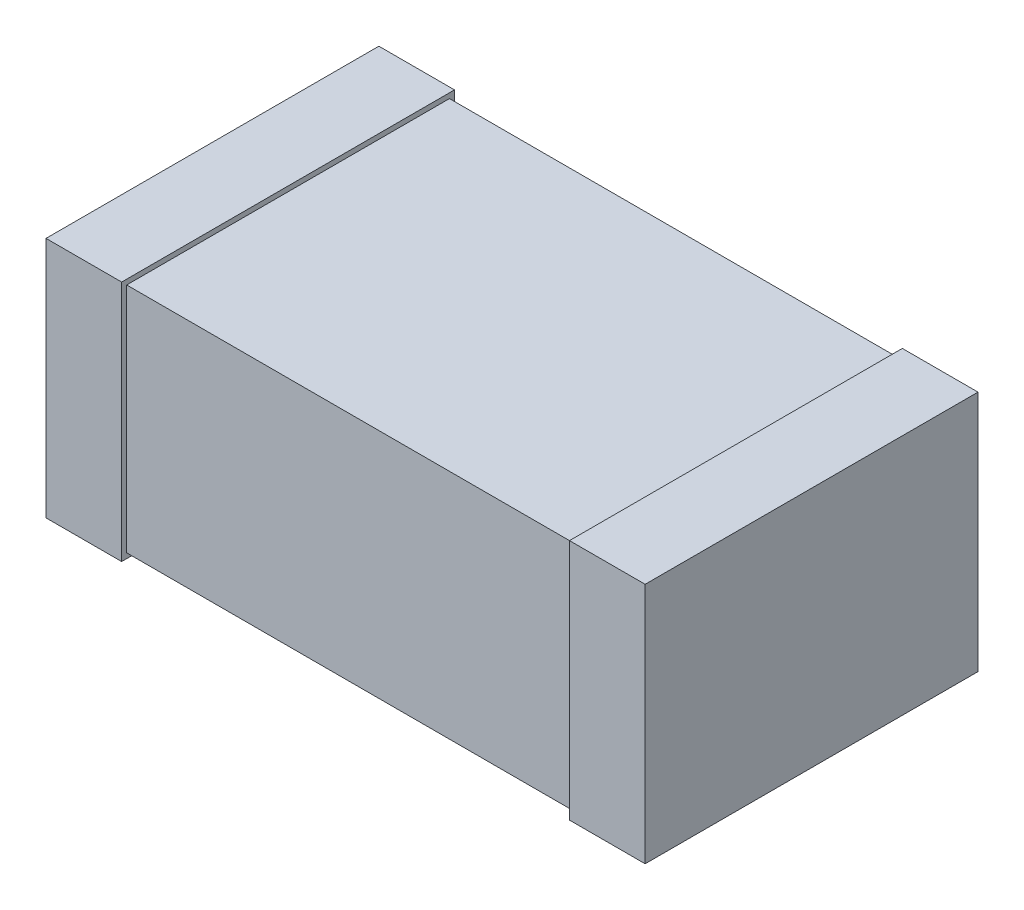
ISO-10303-21;
HEADER;
FILE_DESCRIPTION(('STEP AP214'),'2;1');
FILE_NAME('part.step','',(''),(''),'','','');
FILE_SCHEMA(('AUTOMOTIVE_DESIGN { 1 0 10303 214 1 1 1 1 }'));
ENDSEC;
DATA;
#1=APPLICATION_CONTEXT('core data for automotive mechanical design processes');
#2=APPLICATION_PROTOCOL_DEFINITION('international standard','automotive_design',2000,#1);
#3=PRODUCT_CONTEXT('',#1,'mechanical');
#4=PRODUCT('Part','Part','',(#3));
#5=PRODUCT_RELATED_PRODUCT_CATEGORY('part','',(#4));
#6=PRODUCT_DEFINITION_FORMATION('','',#4);
#7=PRODUCT_DEFINITION_CONTEXT('part definition',#1,'design');
#8=PRODUCT_DEFINITION('design','',#6,#7);
#9=PRODUCT_DEFINITION_SHAPE('','',#8);
#10=(LENGTH_UNIT() NAMED_UNIT(*) SI_UNIT(.MILLI.,.METRE.));
#11=(NAMED_UNIT(*) PLANE_ANGLE_UNIT() SI_UNIT($,.RADIAN.));
#12=(NAMED_UNIT(*) SI_UNIT($,.STERADIAN.) SOLID_ANGLE_UNIT());
#13=UNCERTAINTY_MEASURE_WITH_UNIT(LENGTH_MEASURE(1.E-05),#10,'distance_accuracy_value','');
#14=(GEOMETRIC_REPRESENTATION_CONTEXT(3) GLOBAL_UNCERTAINTY_ASSIGNED_CONTEXT((#13)) GLOBAL_UNIT_ASSIGNED_CONTEXT((#10,
#11,#12)) REPRESENTATION_CONTEXT('',''));
#15=CARTESIAN_POINT('',(0.,0.,0.));
#16=DIRECTION('',(0.,0.,1.));
#17=DIRECTION('',(1.,0.,0.));
#18=AXIS2_PLACEMENT_3D('',#15,#16,#17);
#19=CARTESIAN_POINT('',(-2.25000000000005,2.3,1.59999999999999));
#20=DIRECTION('',(0.,0.,-1.));
#21=DIRECTION('',(-1.,0.,0.));
#22=AXIS2_PLACEMENT_3D('',#19,#20,#21);
#23=PLANE('',#22);
#24=DIRECTION('',(0.,1.,0.));
#25=VECTOR('',#24,1.);
#26=CARTESIAN_POINT('',(-2.22000000000005,2.3,1.59999999999999));
#27=LINE('',#26,#25);
#28=CARTESIAN_POINT('',(-2.22,0.,1.59999999999999));
#29=VERTEX_POINT('',#28);
#30=CARTESIAN_POINT('',(-2.22000000000005,2.3,1.59999999999999));
#31=VERTEX_POINT('',#30);
#32=EDGE_CURVE('E171',#29,#31,#27,.T.);
#33=ORIENTED_EDGE('',*,*,#32,.F.);
#34=DIRECTION('',(1.,0.,0.));
#35=VECTOR('',#34,1.);
#36=CARTESIAN_POINT('',(-2.25,0.,1.59999999999999));
#37=LINE('',#36,#35);
#38=CARTESIAN_POINT('',(2.22,0.,1.6));
#39=VERTEX_POINT('',#38);
#40=EDGE_CURVE('E215',#29,#39,#37,.T.);
#41=ORIENTED_EDGE('',*,*,#40,.T.);
#42=DIRECTION('',(0.,-1.,0.));
#43=VECTOR('',#42,1.);
#44=CARTESIAN_POINT('',(2.21999999999995,2.3,1.6));
#45=LINE('',#44,#43);
#46=CARTESIAN_POINT('',(2.21999999999995,2.3,1.6));
#47=VERTEX_POINT('',#46);
#48=EDGE_CURVE('E210',#47,#39,#45,.T.);
#49=ORIENTED_EDGE('',*,*,#48,.F.);
#50=DIRECTION('',(1.,0.,0.));
#51=VECTOR('',#50,1.);
#52=CARTESIAN_POINT('',(-2.25000000000005,2.3,1.59999999999999));
#53=LINE('',#52,#51);
#54=EDGE_CURVE('E216',#31,#47,#53,.T.);
#55=ORIENTED_EDGE('',*,*,#54,.F.);
#56=EDGE_LOOP('',(#33,#41,#49,#55));
#57=FACE_BOUND('',#56,.T.);
#58=ADVANCED_FACE('F38',(#57),#23,.F.);
#59=CARTESIAN_POINT('',(-2.25,2.3,-1.6));
#60=DIRECTION('',(0.,0.,1.));
#61=DIRECTION('',(1.,0.,0.));
#62=AXIS2_PLACEMENT_3D('',#59,#60,#61);
#63=PLANE('',#62);
#64=DIRECTION('',(0.,-1.,0.));
#65=VECTOR('',#64,1.);
#66=CARTESIAN_POINT('',(-2.22,2.3,-1.6));
#67=LINE('',#66,#65);
#68=CARTESIAN_POINT('',(-2.22,2.3,-1.6));
#69=VERTEX_POINT('',#68);
#70=CARTESIAN_POINT('',(-2.22000000000005,0.,-1.6));
#71=VERTEX_POINT('',#70);
#72=EDGE_CURVE('E52',#69,#71,#67,.T.);
#73=ORIENTED_EDGE('',*,*,#72,.F.);
#74=DIRECTION('',(-1.,0.,0.));
#75=VECTOR('',#74,1.);
#76=CARTESIAN_POINT('',(-2.25,2.3,-1.6));
#77=LINE('',#76,#75);
#78=CARTESIAN_POINT('',(2.22,2.3,-1.6));
#79=VERTEX_POINT('',#78);
#80=EDGE_CURVE('E218',#79,#69,#77,.T.);
#81=ORIENTED_EDGE('',*,*,#80,.F.);
#82=DIRECTION('',(0.,1.,0.));
#83=VECTOR('',#82,1.);
#84=CARTESIAN_POINT('',(2.22,2.3,-1.6));
#85=LINE('',#84,#83);
#86=CARTESIAN_POINT('',(2.21999999999995,0.,-1.6));
#87=VERTEX_POINT('',#86);
#88=EDGE_CURVE('E202',#87,#79,#85,.T.);
#89=ORIENTED_EDGE('',*,*,#88,.F.);
#90=DIRECTION('',(-1.,0.,0.));
#91=VECTOR('',#90,1.);
#92=CARTESIAN_POINT('',(-2.25000000000005,0.,-1.6));
#93=LINE('',#92,#91);
#94=EDGE_CURVE('E219',#87,#71,#93,.T.);
#95=ORIENTED_EDGE('',*,*,#94,.T.);
#96=EDGE_LOOP('',(#73,#81,#89,#95));
#97=FACE_BOUND('',#96,.T.);
#98=ADVANCED_FACE('F233',(#97),#63,.F.);
#99=CARTESIAN_POINT('',(0.,2.3,0.));
#100=DIRECTION('',(0.,1.,0.));
#101=DIRECTION('',(0.,0.,1.));
#102=AXIS2_PLACEMENT_3D('',#99,#100,#101);
#103=PLANE('',#102);
#104=ORIENTED_EDGE('',*,*,#80,.T.);
#105=DIRECTION('',(0.,0.,1.));
#106=VECTOR('',#105,1.);
#107=CARTESIAN_POINT('',(-2.22,2.3,0.));
#108=LINE('',#107,#106);
#109=EDGE_CURVE('E59',#69,#31,#108,.T.);
#110=ORIENTED_EDGE('',*,*,#109,.T.);
#111=ORIENTED_EDGE('',*,*,#54,.T.);
#112=DIRECTION('',(0.,0.,-1.));
#113=VECTOR('',#112,1.);
#114=CARTESIAN_POINT('',(2.22,2.3,0.));
#115=LINE('',#114,#113);
#116=EDGE_CURVE('E213',#47,#79,#115,.T.);
#117=ORIENTED_EDGE('',*,*,#116,.T.);
#118=EDGE_LOOP('',(#104,#110,#111,#117));
#119=FACE_BOUND('',#118,.T.);
#120=ADVANCED_FACE('F234',(#119),#103,.T.);
#121=CARTESIAN_POINT('',(0.,0.,0.));
#122=DIRECTION('',(0.,1.,0.));
#123=DIRECTION('',(0.,0.,1.));
#124=AXIS2_PLACEMENT_3D('',#121,#122,#123);
#125=PLANE('',#124);
#126=DIRECTION('',(0.,0.,1.));
#127=VECTOR('',#126,1.);
#128=CARTESIAN_POINT('',(-2.22,0.,0.));
#129=LINE('',#128,#127);
#130=EDGE_CURVE('E11',#71,#29,#129,.T.);
#131=ORIENTED_EDGE('',*,*,#130,.F.);
#132=ORIENTED_EDGE('',*,*,#94,.F.);
#133=DIRECTION('',(0.,0.,-1.));
#134=VECTOR('',#133,1.);
#135=CARTESIAN_POINT('',(2.22,0.,0.));
#136=LINE('',#135,#134);
#137=EDGE_CURVE('E45',#39,#87,#136,.T.);
#138=ORIENTED_EDGE('',*,*,#137,.F.);
#139=ORIENTED_EDGE('',*,*,#40,.F.);
#140=EDGE_LOOP('',(#131,#132,#138,#139));
#141=FACE_BOUND('',#140,.T.);
#142=ADVANCED_FACE('F231',(#141),#125,.F.);
#143=CARTESIAN_POINT('',(2.21999999999995,2.35,1.65));
#144=DIRECTION('',(0.,0.,1.));
#145=DIRECTION('',(0.,-1.,0.));
#146=AXIS2_PLACEMENT_3D('',#143,#144,#145);
#147=PLANE('',#146);
#148=DIRECTION('',(1.,0.,0.));
#149=VECTOR('',#148,1.);
#150=CARTESIAN_POINT('',(2.22,-0.0499999999999997,1.65));
#151=LINE('',#150,#149);
#152=CARTESIAN_POINT('',(2.22,-0.0499999999999997,1.65));
#153=VERTEX_POINT('',#152);
#154=CARTESIAN_POINT('',(2.97,-0.0499999999999997,1.65));
#155=VERTEX_POINT('',#154);
#156=EDGE_CURVE('E199',#153,#155,#151,.T.);
#157=ORIENTED_EDGE('',*,*,#156,.T.);
#158=DIRECTION('',(0.,-1.,0.));
#159=VECTOR('',#158,1.);
#160=CARTESIAN_POINT('',(2.96999999999995,2.35,1.65));
#161=LINE('',#160,#159);
#162=CARTESIAN_POINT('',(2.96999999999995,2.35,1.65));
#163=VERTEX_POINT('',#162);
#164=EDGE_CURVE('E175',#163,#155,#161,.T.);
#165=ORIENTED_EDGE('',*,*,#164,.F.);
#166=DIRECTION('',(1.,0.,0.));
#167=VECTOR('',#166,1.);
#168=CARTESIAN_POINT('',(2.21999999999995,2.35,1.65));
#169=LINE('',#168,#167);
#170=CARTESIAN_POINT('',(2.21999999999995,2.35,1.65));
#171=VERTEX_POINT('',#170);
#172=EDGE_CURVE('E200',#171,#163,#169,.T.);
#173=ORIENTED_EDGE('',*,*,#172,.F.);
#174=DIRECTION('',(0.,-1.,0.));
#175=VECTOR('',#174,1.);
#176=CARTESIAN_POINT('',(2.21999999999995,2.35,1.65));
#177=LINE('',#176,#175);
#178=EDGE_CURVE('E187',#171,#153,#177,.T.);
#179=ORIENTED_EDGE('',*,*,#178,.T.);
#180=EDGE_LOOP('',(#157,#165,#173,#179));
#181=FACE_BOUND('',#180,.T.);
#182=ADVANCED_FACE('F249',(#181),#147,.T.);
#183=CARTESIAN_POINT('',(2.22,2.35,-1.65));
#184=DIRECTION('',(0.,1.,0.));
#185=DIRECTION('',(0.,0.,1.));
#186=AXIS2_PLACEMENT_3D('',#183,#184,#185);
#187=PLANE('',#186);
#188=ORIENTED_EDGE('',*,*,#172,.T.);
#189=DIRECTION('',(0.,0.,1.));
#190=VECTOR('',#189,1.);
#191=CARTESIAN_POINT('',(2.97,2.35,-1.65));
#192=LINE('',#191,#190);
#193=CARTESIAN_POINT('',(2.97,2.35,-1.65));
#194=VERTEX_POINT('',#193);
#195=EDGE_CURVE('E184',#194,#163,#192,.T.);
#196=ORIENTED_EDGE('',*,*,#195,.F.);
#197=DIRECTION('',(1.,0.,0.));
#198=VECTOR('',#197,1.);
#199=CARTESIAN_POINT('',(2.22,2.35,-1.65));
#200=LINE('',#199,#198);
#201=CARTESIAN_POINT('',(2.22,2.35,-1.65));
#202=VERTEX_POINT('',#201);
#203=EDGE_CURVE('E203',#202,#194,#200,.T.);
#204=ORIENTED_EDGE('',*,*,#203,.F.);
#205=DIRECTION('',(0.,0.,1.));
#206=VECTOR('',#205,1.);
#207=CARTESIAN_POINT('',(2.22,2.35,-1.65));
#208=LINE('',#207,#206);
#209=EDGE_CURVE('E196',#202,#171,#208,.T.);
#210=ORIENTED_EDGE('',*,*,#209,.T.);
#211=EDGE_LOOP('',(#188,#196,#204,#210));
#212=FACE_BOUND('',#211,.T.);
#213=ADVANCED_FACE('F253',(#212),#187,.T.);
#214=CARTESIAN_POINT('',(2.21999999999995,-0.0499999999999997,-1.65));
#215=DIRECTION('',(0.,0.,-1.));
#216=DIRECTION('',(-1.,0.,0.));
#217=AXIS2_PLACEMENT_3D('',#214,#215,#216);
#218=PLANE('',#217);
#219=ORIENTED_EDGE('',*,*,#203,.T.);
#220=DIRECTION('',(0.,1.,0.));
#221=VECTOR('',#220,1.);
#222=CARTESIAN_POINT('',(2.96999999999995,-0.0499999999999997,-1.65));
#223=LINE('',#222,#221);
#224=CARTESIAN_POINT('',(2.96999999999995,-0.0499999999999997,-1.65));
#225=VERTEX_POINT('',#224);
#226=EDGE_CURVE('E181',#225,#194,#223,.T.);
#227=ORIENTED_EDGE('',*,*,#226,.F.);
#228=DIRECTION('',(1.,0.,0.));
#229=VECTOR('',#228,1.);
#230=CARTESIAN_POINT('',(2.21999999999995,-0.0499999999999997,-1.65));
#231=LINE('',#230,#229);
#232=CARTESIAN_POINT('',(2.21999999999995,-0.0499999999999997,-1.65));
#233=VERTEX_POINT('',#232);
#234=EDGE_CURVE('E205',#233,#225,#231,.T.);
#235=ORIENTED_EDGE('',*,*,#234,.F.);
#236=DIRECTION('',(0.,1.,0.));
#237=VECTOR('',#236,1.);
#238=CARTESIAN_POINT('',(2.21999999999995,-0.0499999999999997,-1.65));
#239=LINE('',#238,#237);
#240=EDGE_CURVE('E193',#233,#202,#239,.T.);
#241=ORIENTED_EDGE('',*,*,#240,.T.);
#242=EDGE_LOOP('',(#219,#227,#235,#241));
#243=FACE_BOUND('',#242,.T.);
#244=ADVANCED_FACE('F258',(#243),#218,.T.);
#245=CARTESIAN_POINT('',(2.22,-0.0499999999999997,1.65));
#246=DIRECTION('',(0.,-1.,0.));
#247=DIRECTION('',(0.,0.,-1.));
#248=AXIS2_PLACEMENT_3D('',#245,#246,#247);
#249=PLANE('',#248);
#250=ORIENTED_EDGE('',*,*,#234,.T.);
#251=DIRECTION('',(0.,0.,-1.));
#252=VECTOR('',#251,1.);
#253=CARTESIAN_POINT('',(2.97,-0.0499999999999997,1.65));
#254=LINE('',#253,#252);
#255=EDGE_CURVE('E178',#155,#225,#254,.T.);
#256=ORIENTED_EDGE('',*,*,#255,.F.);
#257=ORIENTED_EDGE('',*,*,#156,.F.);
#258=DIRECTION('',(0.,0.,-1.));
#259=VECTOR('',#258,1.);
#260=CARTESIAN_POINT('',(2.22,-0.0499999999999997,1.65));
#261=LINE('',#260,#259);
#262=EDGE_CURVE('E190',#153,#233,#261,.T.);
#263=ORIENTED_EDGE('',*,*,#262,.T.);
#264=EDGE_LOOP('',(#250,#256,#257,#263));
#265=FACE_BOUND('',#264,.T.);
#266=ADVANCED_FACE('F255',(#265),#249,.T.);
#267=CARTESIAN_POINT('',(2.22,0.,0.));
#268=DIRECTION('',(1.,0.,0.));
#269=DIRECTION('',(0.,0.,-1.));
#270=AXIS2_PLACEMENT_3D('',#267,#268,#269);
#271=PLANE('',#270);
#272=ORIENTED_EDGE('',*,*,#116,.F.);
#273=ORIENTED_EDGE('',*,*,#48,.T.);
#274=ORIENTED_EDGE('',*,*,#137,.T.);
#275=ORIENTED_EDGE('',*,*,#88,.T.);
#276=EDGE_LOOP('',(#272,#273,#274,#275));
#277=FACE_BOUND('',#276,.T.);
#278=ORIENTED_EDGE('',*,*,#178,.F.);
#279=ORIENTED_EDGE('',*,*,#209,.F.);
#280=ORIENTED_EDGE('',*,*,#240,.F.);
#281=ORIENTED_EDGE('',*,*,#262,.F.);
#282=EDGE_LOOP('',(#278,#279,#280,#281));
#283=FACE_BOUND('',#282,.T.);
#284=ADVANCED_FACE('F226',(#277,#283),#271,.F.);
#285=CARTESIAN_POINT('',(2.97,0.,0.));
#286=DIRECTION('',(1.,0.,0.));
#287=DIRECTION('',(0.,0.,-1.));
#288=AXIS2_PLACEMENT_3D('',#285,#286,#287);
#289=PLANE('',#288);
#290=ORIENTED_EDGE('',*,*,#164,.T.);
#291=ORIENTED_EDGE('',*,*,#255,.T.);
#292=ORIENTED_EDGE('',*,*,#226,.T.);
#293=ORIENTED_EDGE('',*,*,#195,.T.);
#294=EDGE_LOOP('',(#290,#291,#292,#293));
#295=FACE_BOUND('',#294,.T.);
#296=ADVANCED_FACE('F268',(#295),#289,.T.);
#297=CARTESIAN_POINT('',(-2.22000000000005,2.35,1.65));
#298=DIRECTION('',(0.,0.,-1.));
#299=DIRECTION('',(0.,1.,0.));
#300=AXIS2_PLACEMENT_3D('',#297,#298,#299);
#301=PLANE('',#300);
#302=DIRECTION('',(-1.,0.,0.));
#303=VECTOR('',#302,1.);
#304=CARTESIAN_POINT('',(-2.22000000000005,2.35,1.65));
#305=LINE('',#304,#303);
#306=CARTESIAN_POINT('',(-2.22000000000005,2.35,1.65));
#307=VERTEX_POINT('',#306);
#308=CARTESIAN_POINT('',(-2.97000000000005,2.35000000000001,1.65));
#309=VERTEX_POINT('',#308);
#310=EDGE_CURVE('E129',#307,#309,#305,.T.);
#311=ORIENTED_EDGE('',*,*,#310,.T.);
#312=DIRECTION('',(0.,-1.,0.));
#313=VECTOR('',#312,1.);
#314=CARTESIAN_POINT('',(-2.97000000000005,2.35000000000001,1.65));
#315=LINE('',#314,#313);
#316=CARTESIAN_POINT('',(-2.97,-0.0499999999999876,1.65));
#317=VERTEX_POINT('',#316);
#318=EDGE_CURVE('E133',#309,#317,#315,.T.);
#319=ORIENTED_EDGE('',*,*,#318,.T.);
#320=DIRECTION('',(-1.,0.,0.));
#321=VECTOR('',#320,1.);
#322=CARTESIAN_POINT('',(-2.22,-0.0499999999999997,1.65));
#323=LINE('',#322,#321);
#324=CARTESIAN_POINT('',(-2.22,-0.0499999999999997,1.65));
#325=VERTEX_POINT('',#324);
#326=EDGE_CURVE('E165',#325,#317,#323,.T.);
#327=ORIENTED_EDGE('',*,*,#326,.F.);
#328=DIRECTION('',(0.,-1.,0.));
#329=VECTOR('',#328,1.);
#330=CARTESIAN_POINT('',(-2.22000000000005,2.35,1.65));
#331=LINE('',#330,#329);
#332=EDGE_CURVE('E136',#307,#325,#331,.T.);
#333=ORIENTED_EDGE('',*,*,#332,.F.);
#334=EDGE_LOOP('',(#311,#319,#327,#333));
#335=FACE_BOUND('',#334,.T.);
#336=ADVANCED_FACE('F131',(#335),#301,.F.);
#337=CARTESIAN_POINT('',(-2.22,-0.0499999999999997,1.65));
#338=DIRECTION('',(0.,1.,0.));
#339=DIRECTION('',(0.,0.,1.));
#340=AXIS2_PLACEMENT_3D('',#337,#338,#339);
#341=PLANE('',#340);
#342=ORIENTED_EDGE('',*,*,#326,.T.);
#343=DIRECTION('',(0.,0.,-1.));
#344=VECTOR('',#343,1.);
#345=CARTESIAN_POINT('',(-2.97,-0.0499999999999876,1.65));
#346=LINE('',#345,#344);
#347=CARTESIAN_POINT('',(-2.97000000000005,-0.0499999999999876,-1.65));
#348=VERTEX_POINT('',#347);
#349=EDGE_CURVE('E150',#317,#348,#346,.T.);
#350=ORIENTED_EDGE('',*,*,#349,.T.);
#351=DIRECTION('',(-1.,0.,0.));
#352=VECTOR('',#351,1.);
#353=CARTESIAN_POINT('',(-2.22000000000005,-0.0499999999999997,-1.65));
#354=LINE('',#353,#352);
#355=CARTESIAN_POINT('',(-2.22000000000005,-0.0499999999999997,-1.65));
#356=VERTEX_POINT('',#355);
#357=EDGE_CURVE('E167',#356,#348,#354,.T.);
#358=ORIENTED_EDGE('',*,*,#357,.F.);
#359=DIRECTION('',(0.,0.,-1.));
#360=VECTOR('',#359,1.);
#361=CARTESIAN_POINT('',(-2.22,-0.0499999999999997,1.65));
#362=LINE('',#361,#360);
#363=EDGE_CURVE('E141',#325,#356,#362,.T.);
#364=ORIENTED_EDGE('',*,*,#363,.F.);
#365=EDGE_LOOP('',(#342,#350,#358,#364));
#366=FACE_BOUND('',#365,.T.);
#367=ADVANCED_FACE('F274',(#366),#341,.F.);
#368=CARTESIAN_POINT('',(-2.22000000000005,-0.0499999999999997,-1.65));
#369=DIRECTION('',(0.,0.,1.));
#370=DIRECTION('',(1.,0.,0.));
#371=AXIS2_PLACEMENT_3D('',#368,#369,#370);
#372=PLANE('',#371);
#373=ORIENTED_EDGE('',*,*,#357,.T.);
#374=DIRECTION('',(0.,1.,0.));
#375=VECTOR('',#374,1.);
#376=CARTESIAN_POINT('',(-2.97000000000005,-0.0499999999999876,-1.65));
#377=LINE('',#376,#375);
#378=CARTESIAN_POINT('',(-2.97,2.35000000000001,-1.65));
#379=VERTEX_POINT('',#378);
#380=EDGE_CURVE('E154',#348,#379,#377,.T.);
#381=ORIENTED_EDGE('',*,*,#380,.T.);
#382=DIRECTION('',(-1.,0.,0.));
#383=VECTOR('',#382,1.);
#384=CARTESIAN_POINT('',(-2.22,2.35,-1.65));
#385=LINE('',#384,#383);
#386=CARTESIAN_POINT('',(-2.22,2.35,-1.65));
#387=VERTEX_POINT('',#386);
#388=EDGE_CURVE('E140',#387,#379,#385,.T.);
#389=ORIENTED_EDGE('',*,*,#388,.F.);
#390=DIRECTION('',(0.,1.,0.));
#391=VECTOR('',#390,1.);
#392=CARTESIAN_POINT('',(-2.22000000000005,-0.0499999999999997,-1.65));
#393=LINE('',#392,#391);
#394=EDGE_CURVE('E162',#356,#387,#393,.T.);
#395=ORIENTED_EDGE('',*,*,#394,.F.);
#396=EDGE_LOOP('',(#373,#381,#389,#395));
#397=FACE_BOUND('',#396,.T.);
#398=ADVANCED_FACE('F277',(#397),#372,.F.);
#399=CARTESIAN_POINT('',(-2.22,2.35,-1.65));
#400=DIRECTION('',(0.,-1.,0.));
#401=DIRECTION('',(0.,0.,-1.));
#402=AXIS2_PLACEMENT_3D('',#399,#400,#401);
#403=PLANE('',#402);
#404=ORIENTED_EDGE('',*,*,#388,.T.);
#405=DIRECTION('',(0.,0.,1.));
#406=VECTOR('',#405,1.);
#407=CARTESIAN_POINT('',(-2.97,2.35000000000001,-1.65));
#408=LINE('',#407,#406);
#409=EDGE_CURVE('E147',#379,#309,#408,.T.);
#410=ORIENTED_EDGE('',*,*,#409,.T.);
#411=ORIENTED_EDGE('',*,*,#310,.F.);
#412=DIRECTION('',(0.,0.,1.));
#413=VECTOR('',#412,1.);
#414=CARTESIAN_POINT('',(-2.22,2.35,-1.65));
#415=LINE('',#414,#413);
#416=EDGE_CURVE('E160',#387,#307,#415,.T.);
#417=ORIENTED_EDGE('',*,*,#416,.F.);
#418=EDGE_LOOP('',(#404,#410,#411,#417));
#419=FACE_BOUND('',#418,.T.);
#420=ADVANCED_FACE('F152',(#419),#403,.F.);
#421=CARTESIAN_POINT('',(-2.22,0.,0.));
#422=DIRECTION('',(-1.,0.,0.));
#423=DIRECTION('',(0.,0.,-1.));
#424=AXIS2_PLACEMENT_3D('',#421,#422,#423);
#425=PLANE('',#424);
#426=ORIENTED_EDGE('',*,*,#109,.F.);
#427=ORIENTED_EDGE('',*,*,#72,.T.);
#428=ORIENTED_EDGE('',*,*,#130,.T.);
#429=ORIENTED_EDGE('',*,*,#32,.T.);
#430=EDGE_LOOP('',(#426,#427,#428,#429));
#431=FACE_BOUND('',#430,.T.);
#432=ORIENTED_EDGE('',*,*,#332,.T.);
#433=ORIENTED_EDGE('',*,*,#363,.T.);
#434=ORIENTED_EDGE('',*,*,#394,.T.);
#435=ORIENTED_EDGE('',*,*,#416,.T.);
#436=EDGE_LOOP('',(#432,#433,#434,#435));
#437=FACE_BOUND('',#436,.T.);
#438=ADVANCED_FACE('F236',(#431,#437),#425,.F.);
#439=CARTESIAN_POINT('',(-2.97,0.,0.));
#440=DIRECTION('',(-1.,0.,0.));
#441=DIRECTION('',(0.,0.,-1.));
#442=AXIS2_PLACEMENT_3D('',#439,#440,#441);
#443=PLANE('',#442);
#444=ORIENTED_EDGE('',*,*,#318,.F.);
#445=ORIENTED_EDGE('',*,*,#409,.F.);
#446=ORIENTED_EDGE('',*,*,#380,.F.);
#447=ORIENTED_EDGE('',*,*,#349,.F.);
#448=EDGE_LOOP('',(#444,#445,#446,#447));
#449=FACE_BOUND('',#448,.T.);
#450=ADVANCED_FACE('F145',(#449),#443,.T.);
#451=CLOSED_SHELL('',(#58,#98,#120,#142,#182,#213,#244,#266,#284,#296,#336,#367,#398,#420,#438,#450));
#452=MANIFOLD_SOLID_BREP('B2',#451);
#453=ADVANCED_BREP_SHAPE_REPRESENTATION('',(#18,#452),#14);
#454=SHAPE_DEFINITION_REPRESENTATION(#9,#453);
ENDSEC;
END-ISO-10303-21;
